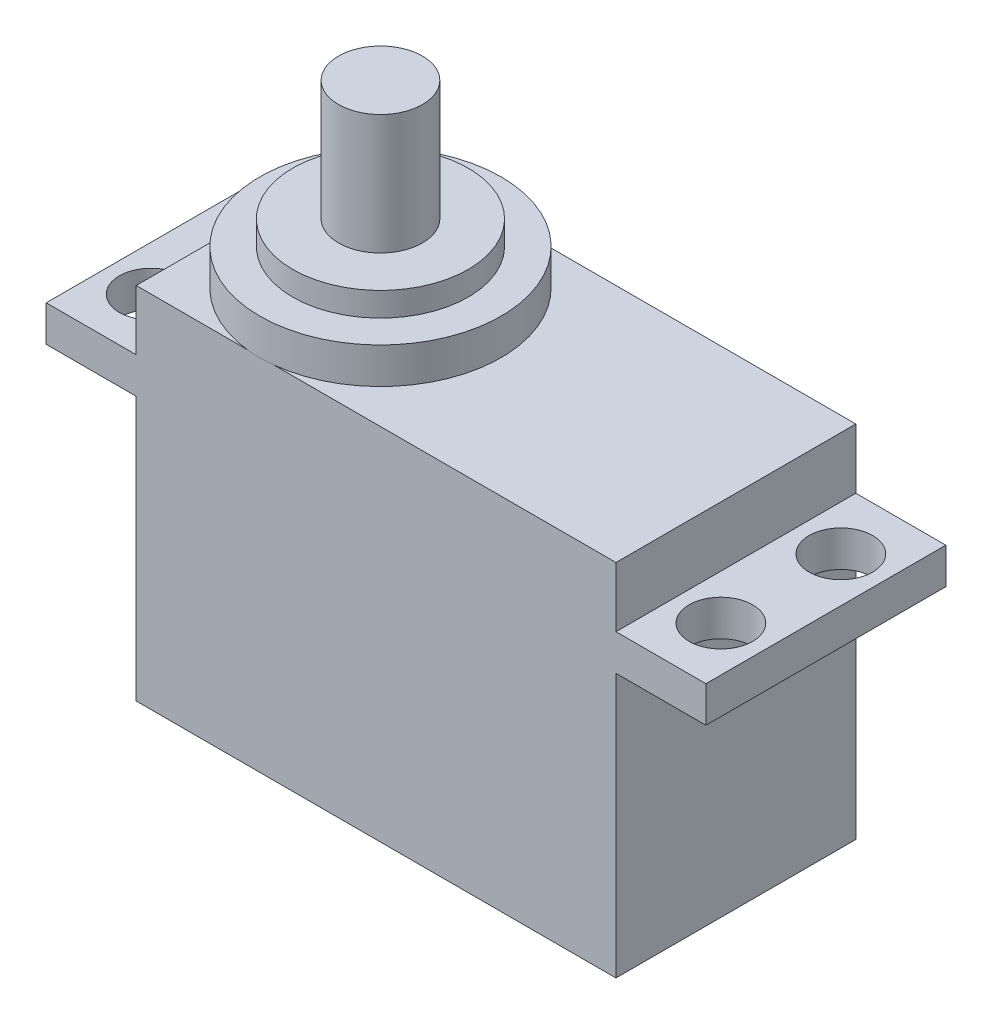
ISO-10303-21;
HEADER;
FILE_DESCRIPTION(('STEP AP214'),'2;1');
FILE_NAME('part.step','',(''),(''),'','','');
FILE_SCHEMA(('AUTOMOTIVE_DESIGN { 1 0 10303 214 1 1 1 1 }'));
ENDSEC;
DATA;
#1=APPLICATION_CONTEXT('core data for automotive mechanical design processes');
#2=APPLICATION_PROTOCOL_DEFINITION('international standard','automotive_design',2000,#1);
#3=PRODUCT_CONTEXT('',#1,'mechanical');
#4=PRODUCT('Part','Part','',(#3));
#5=PRODUCT_RELATED_PRODUCT_CATEGORY('part','',(#4));
#6=PRODUCT_DEFINITION_FORMATION('','',#4);
#7=PRODUCT_DEFINITION_CONTEXT('part definition',#1,'design');
#8=PRODUCT_DEFINITION('design','',#6,#7);
#9=PRODUCT_DEFINITION_SHAPE('','',#8);
#10=(LENGTH_UNIT() NAMED_UNIT(*) SI_UNIT(.MILLI.,.METRE.));
#11=(NAMED_UNIT(*) PLANE_ANGLE_UNIT() SI_UNIT($,.RADIAN.));
#12=(NAMED_UNIT(*) SI_UNIT($,.STERADIAN.) SOLID_ANGLE_UNIT());
#13=UNCERTAINTY_MEASURE_WITH_UNIT(LENGTH_MEASURE(1.E-05),#10,'distance_accuracy_value','');
#14=(GEOMETRIC_REPRESENTATION_CONTEXT(3) GLOBAL_UNCERTAINTY_ASSIGNED_CONTEXT((#13)) GLOBAL_UNIT_ASSIGNED_CONTEXT((#10,
#11,#12)) REPRESENTATION_CONTEXT('',''));
#15=CARTESIAN_POINT('',(0.,0.,0.));
#16=DIRECTION('',(0.,0.,1.));
#17=DIRECTION('',(1.,0.,0.));
#18=AXIS2_PLACEMENT_3D('',#15,#16,#17);
#19=CARTESIAN_POINT('',(0.,30.,0.));
#20=DIRECTION('',(0.,-1.,0.));
#21=DIRECTION('',(0.,0.,-1.));
#22=AXIS2_PLACEMENT_3D('',#19,#20,#21);
#23=PLANE('',#22);
#24=CARTESIAN_POINT('',(-9.63155127611361,30.,0.));
#25=DIRECTION('',(0.,1.,0.));
#26=DIRECTION('',(0.,0.,1.));
#27=AXIS2_PLACEMENT_3D('',#24,#25,#26);
#28=CIRCLE('',#27,10.0603687613684);
#29=CARTESIAN_POINT('',(-8.53108791247185,30.,10.));
#30=VERTEX_POINT('',#29);
#31=CARTESIAN_POINT('',(-8.53108791247189,30.,-10.));
#32=VERTEX_POINT('',#31);
#33=EDGE_CURVE('E43',#30,#32,#28,.T.);
#34=ORIENTED_EDGE('',*,*,#33,.F.);
#35=DIRECTION('',(1.,0.,0.));
#36=VECTOR('',#35,1.);
#37=CARTESIAN_POINT('',(-20.,30.,10.));
#38=LINE('',#37,#36);
#39=CARTESIAN_POINT('',(20.,30.,10.));
#40=VERTEX_POINT('',#39);
#41=EDGE_CURVE('E144',#30,#40,#38,.T.);
#42=ORIENTED_EDGE('',*,*,#41,.T.);
#43=DIRECTION('',(0.,0.,-1.));
#44=VECTOR('',#43,1.);
#45=CARTESIAN_POINT('',(20.,30.,10.));
#46=LINE('',#45,#44);
#47=CARTESIAN_POINT('',(20.,30.,-10.));
#48=VERTEX_POINT('',#47);
#49=EDGE_CURVE('E227',#40,#48,#46,.T.);
#50=ORIENTED_EDGE('',*,*,#49,.T.);
#51=DIRECTION('',(-1.,0.,0.));
#52=VECTOR('',#51,1.);
#53=CARTESIAN_POINT('',(-20.,30.,-10.));
#54=LINE('',#53,#52);
#55=EDGE_CURVE('E232',#48,#32,#54,.T.);
#56=ORIENTED_EDGE('',*,*,#55,.T.);
#57=EDGE_LOOP('',(#34,#42,#50,#56));
#58=FACE_BOUND('',#57,.T.);
#59=ADVANCED_FACE('F32',(#58),#23,.F.);
#60=CARTESIAN_POINT('',(20.,30.,10.));
#61=DIRECTION('',(-1.,0.,0.));
#62=DIRECTION('',(0.,0.,1.));
#63=AXIS2_PLACEMENT_3D('',#60,#61,#62);
#64=PLANE('',#63);
#65=DIRECTION('',(0.,0.,1.));
#66=VECTOR('',#65,1.);
#67=CARTESIAN_POINT('',(20.,25.,10.));
#68=LINE('',#67,#66);
#69=CARTESIAN_POINT('',(20.,25.,-10.));
#70=VERTEX_POINT('',#69);
#71=CARTESIAN_POINT('',(20.,25.,10.));
#72=VERTEX_POINT('',#71);
#73=EDGE_CURVE('E224',#70,#72,#68,.T.);
#74=ORIENTED_EDGE('',*,*,#73,.F.);
#75=DIRECTION('',(0.,-1.,0.));
#76=VECTOR('',#75,1.);
#77=CARTESIAN_POINT('',(20.,30.,-10.));
#78=LINE('',#77,#76);
#79=EDGE_CURVE('E41',#48,#70,#78,.T.);
#80=ORIENTED_EDGE('',*,*,#79,.F.);
#81=ORIENTED_EDGE('',*,*,#49,.F.);
#82=DIRECTION('',(0.,-1.,0.));
#83=VECTOR('',#82,1.);
#84=CARTESIAN_POINT('',(20.,30.,10.));
#85=LINE('',#84,#83);
#86=EDGE_CURVE('E246',#40,#72,#85,.T.);
#87=ORIENTED_EDGE('',*,*,#86,.T.);
#88=EDGE_LOOP('',(#74,#80,#81,#87));
#89=FACE_BOUND('',#88,.T.);
#90=ADVANCED_FACE('F323',(#89),#64,.F.);
#91=CARTESIAN_POINT('',(-20.,30.,10.));
#92=DIRECTION('',(1.,0.,0.));
#93=DIRECTION('',(0.,0.,-1.));
#94=AXIS2_PLACEMENT_3D('',#91,#92,#93);
#95=PLANE('',#94);
#96=DIRECTION('',(0.,0.,-1.));
#97=VECTOR('',#96,1.);
#98=CARTESIAN_POINT('',(-20.,25.,10.));
#99=LINE('',#98,#97);
#100=CARTESIAN_POINT('',(-20.,25.,10.));
#101=VERTEX_POINT('',#100);
#102=CARTESIAN_POINT('',(-20.,25.,-10.));
#103=VERTEX_POINT('',#102);
#104=EDGE_CURVE('E222',#101,#103,#99,.T.);
#105=ORIENTED_EDGE('',*,*,#104,.F.);
#106=DIRECTION('',(0.,-1.,0.));
#107=VECTOR('',#106,1.);
#108=CARTESIAN_POINT('',(-20.,30.,10.));
#109=LINE('',#108,#107);
#110=CARTESIAN_POINT('',(-20.,30.,10.));
#111=VERTEX_POINT('',#110);
#112=EDGE_CURVE('E250',#111,#101,#109,.T.);
#113=ORIENTED_EDGE('',*,*,#112,.F.);
#114=DIRECTION('',(0.,0.,1.));
#115=VECTOR('',#114,1.);
#116=CARTESIAN_POINT('',(-20.,30.,10.));
#117=LINE('',#116,#115);
#118=CARTESIAN_POINT('',(-20.,30.,-10.));
#119=VERTEX_POINT('',#118);
#120=EDGE_CURVE('E137',#119,#111,#117,.T.);
#121=ORIENTED_EDGE('',*,*,#120,.F.);
#122=DIRECTION('',(0.,-1.,0.));
#123=VECTOR('',#122,1.);
#124=CARTESIAN_POINT('',(-20.,30.,-10.));
#125=LINE('',#124,#123);
#126=EDGE_CURVE('E253',#119,#103,#125,.T.);
#127=ORIENTED_EDGE('',*,*,#126,.T.);
#128=EDGE_LOOP('',(#105,#113,#121,#127));
#129=FACE_BOUND('',#128,.T.);
#130=ADVANCED_FACE('F306',(#129),#95,.F.);
#131=CARTESIAN_POINT('',(20.,22.,-10.));
#132=VERTEX_POINT('',#131);
#133=CARTESIAN_POINT('',(20.,0.,-10.));
#134=VERTEX_POINT('',#133);
#135=EDGE_CURVE('E256',#132,#134,#78,.T.);
#136=ORIENTED_EDGE('',*,*,#135,.F.);
#137=DIRECTION('',(0.,0.,1.));
#138=VECTOR('',#137,1.);
#139=CARTESIAN_POINT('',(20.,22.,10.));
#140=LINE('',#139,#138);
#141=CARTESIAN_POINT('',(20.,22.,10.));
#142=VERTEX_POINT('',#141);
#143=EDGE_CURVE('E219',#132,#142,#140,.T.);
#144=ORIENTED_EDGE('',*,*,#143,.T.);
#145=CARTESIAN_POINT('',(20.,0.,10.));
#146=VERTEX_POINT('',#145);
#147=EDGE_CURVE('E141',#142,#146,#85,.T.);
#148=ORIENTED_EDGE('',*,*,#147,.T.);
#149=DIRECTION('',(0.,0.,-1.));
#150=VECTOR('',#149,1.);
#151=CARTESIAN_POINT('',(20.,0.,10.));
#152=LINE('',#151,#150);
#153=EDGE_CURVE('E226',#146,#134,#152,.T.);
#154=ORIENTED_EDGE('',*,*,#153,.T.);
#155=EDGE_LOOP('',(#136,#144,#148,#154));
#156=FACE_BOUND('',#155,.T.);
#157=ADVANCED_FACE('F34',(#156),#64,.F.);
#158=CARTESIAN_POINT('',(-20.,30.,-10.));
#159=DIRECTION('',(0.,0.,1.));
#160=DIRECTION('',(1.,0.,0.));
#161=AXIS2_PLACEMENT_3D('',#158,#159,#160);
#162=PLANE('',#161);
#163=CARTESIAN_POINT('',(-20.,22.,-10.));
#164=VERTEX_POINT('',#163);
#165=CARTESIAN_POINT('',(-20.,0.,-10.));
#166=VERTEX_POINT('',#165);
#167=EDGE_CURVE('E252',#164,#166,#125,.T.);
#168=ORIENTED_EDGE('',*,*,#167,.F.);
#169=DIRECTION('',(-1.,0.,0.));
#170=VECTOR('',#169,1.);
#171=CARTESIAN_POINT('',(-27.5,22.,-10.));
#172=LINE('',#171,#170);
#173=CARTESIAN_POINT('',(-27.5,22.,-10.));
#174=VERTEX_POINT('',#173);
#175=EDGE_CURVE('E196',#164,#174,#172,.T.);
#176=ORIENTED_EDGE('',*,*,#175,.T.);
#177=DIRECTION('',(0.,-1.,0.));
#178=VECTOR('',#177,1.);
#179=CARTESIAN_POINT('',(-27.5,25.,-10.));
#180=LINE('',#179,#178);
#181=CARTESIAN_POINT('',(-27.5,25.,-10.));
#182=VERTEX_POINT('',#181);
#183=EDGE_CURVE('E210',#182,#174,#180,.T.);
#184=ORIENTED_EDGE('',*,*,#183,.F.);
#185=DIRECTION('',(-1.,0.,0.));
#186=VECTOR('',#185,1.);
#187=CARTESIAN_POINT('',(-27.5,25.,-10.));
#188=LINE('',#187,#186);
#189=EDGE_CURVE('E183',#103,#182,#188,.T.);
#190=ORIENTED_EDGE('',*,*,#189,.F.);
#191=ORIENTED_EDGE('',*,*,#126,.F.);
#192=CARTESIAN_POINT('',(-10.7320146397553,30.,-10.));
#193=VERTEX_POINT('',#192);
#194=EDGE_CURVE('E230',#193,#119,#54,.T.);
#195=ORIENTED_EDGE('',*,*,#194,.F.);
#196=EDGE_CURVE('E234',#32,#193,#54,.T.);
#197=ORIENTED_EDGE('',*,*,#196,.F.);
#198=ORIENTED_EDGE('',*,*,#55,.F.);
#199=ORIENTED_EDGE('',*,*,#79,.T.);
#200=CARTESIAN_POINT('',(27.5,25.,-10.));
#201=VERTEX_POINT('',#200);
#202=EDGE_CURVE('E185',#201,#70,#188,.T.);
#203=ORIENTED_EDGE('',*,*,#202,.F.);
#204=DIRECTION('',(0.,-1.,0.));
#205=VECTOR('',#204,1.);
#206=CARTESIAN_POINT('',(27.5,25.,-10.));
#207=LINE('',#206,#205);
#208=CARTESIAN_POINT('',(27.5,22.,-10.));
#209=VERTEX_POINT('',#208);
#210=EDGE_CURVE('E213',#201,#209,#207,.T.);
#211=ORIENTED_EDGE('',*,*,#210,.T.);
#212=EDGE_CURVE('E197',#209,#132,#172,.T.);
#213=ORIENTED_EDGE('',*,*,#212,.T.);
#214=ORIENTED_EDGE('',*,*,#135,.T.);
#215=DIRECTION('',(-1.,0.,0.));
#216=VECTOR('',#215,1.);
#217=CARTESIAN_POINT('',(-20.,0.,-10.));
#218=LINE('',#217,#216);
#219=EDGE_CURVE('E238',#134,#166,#218,.T.);
#220=ORIENTED_EDGE('',*,*,#219,.T.);
#221=EDGE_LOOP('',(#168,#176,#184,#190,#191,#195,#197,#198,#199,#203,#211,#213,#214,#220));
#222=FACE_BOUND('',#221,.T.);
#223=ADVANCED_FACE('F281',(#222),#162,.F.);
#224=CARTESIAN_POINT('',(-20.,22.,10.));
#225=VERTEX_POINT('',#224);
#226=CARTESIAN_POINT('',(-20.,0.,10.));
#227=VERTEX_POINT('',#226);
#228=EDGE_CURVE('E249',#225,#227,#109,.T.);
#229=ORIENTED_EDGE('',*,*,#228,.F.);
#230=DIRECTION('',(0.,0.,-1.));
#231=VECTOR('',#230,1.);
#232=CARTESIAN_POINT('',(-20.,22.,10.));
#233=LINE('',#232,#231);
#234=EDGE_CURVE('E216',#225,#164,#233,.T.);
#235=ORIENTED_EDGE('',*,*,#234,.T.);
#236=ORIENTED_EDGE('',*,*,#167,.T.);
#237=DIRECTION('',(0.,0.,1.));
#238=VECTOR('',#237,1.);
#239=CARTESIAN_POINT('',(-20.,0.,10.));
#240=LINE('',#239,#238);
#241=EDGE_CURVE('E241',#166,#227,#240,.T.);
#242=ORIENTED_EDGE('',*,*,#241,.T.);
#243=EDGE_LOOP('',(#229,#235,#236,#242));
#244=FACE_BOUND('',#243,.T.);
#245=ADVANCED_FACE('F292',(#244),#95,.F.);
#246=CARTESIAN_POINT('',(-20.,30.,10.));
#247=DIRECTION('',(0.,0.,-1.));
#248=DIRECTION('',(-1.,0.,0.));
#249=AXIS2_PLACEMENT_3D('',#246,#247,#248);
#250=PLANE('',#249);
#251=ORIENTED_EDGE('',*,*,#147,.F.);
#252=DIRECTION('',(1.,0.,0.));
#253=VECTOR('',#252,1.);
#254=CARTESIAN_POINT('',(-27.5,22.,10.));
#255=LINE('',#254,#253);
#256=CARTESIAN_POINT('',(27.5,22.,10.));
#257=VERTEX_POINT('',#256);
#258=EDGE_CURVE('E202',#142,#257,#255,.T.);
#259=ORIENTED_EDGE('',*,*,#258,.T.);
#260=DIRECTION('',(0.,-1.,0.));
#261=VECTOR('',#260,1.);
#262=CARTESIAN_POINT('',(27.5,25.,10.));
#263=LINE('',#262,#261);
#264=CARTESIAN_POINT('',(27.5,25.,10.));
#265=VERTEX_POINT('',#264);
#266=EDGE_CURVE('E192',#265,#257,#263,.T.);
#267=ORIENTED_EDGE('',*,*,#266,.F.);
#268=DIRECTION('',(1.,0.,0.));
#269=VECTOR('',#268,1.);
#270=CARTESIAN_POINT('',(-27.5,25.,10.));
#271=LINE('',#270,#269);
#272=EDGE_CURVE('E189',#72,#265,#271,.T.);
#273=ORIENTED_EDGE('',*,*,#272,.F.);
#274=ORIENTED_EDGE('',*,*,#86,.F.);
#275=ORIENTED_EDGE('',*,*,#41,.F.);
#276=CARTESIAN_POINT('',(-10.7320146397554,30.,10.));
#277=VERTEX_POINT('',#276);
#278=EDGE_CURVE('E142',#277,#30,#38,.T.);
#279=ORIENTED_EDGE('',*,*,#278,.F.);
#280=EDGE_CURVE('E133',#111,#277,#38,.T.);
#281=ORIENTED_EDGE('',*,*,#280,.F.);
#282=ORIENTED_EDGE('',*,*,#112,.T.);
#283=CARTESIAN_POINT('',(-27.5,25.,10.));
#284=VERTEX_POINT('',#283);
#285=EDGE_CURVE('E190',#284,#101,#271,.T.);
#286=ORIENTED_EDGE('',*,*,#285,.F.);
#287=DIRECTION('',(0.,-1.,0.));
#288=VECTOR('',#287,1.);
#289=CARTESIAN_POINT('',(-27.5,25.,10.));
#290=LINE('',#289,#288);
#291=CARTESIAN_POINT('',(-27.5,22.,10.));
#292=VERTEX_POINT('',#291);
#293=EDGE_CURVE('E207',#284,#292,#290,.T.);
#294=ORIENTED_EDGE('',*,*,#293,.T.);
#295=EDGE_CURVE('E184',#292,#225,#255,.T.);
#296=ORIENTED_EDGE('',*,*,#295,.T.);
#297=ORIENTED_EDGE('',*,*,#228,.T.);
#298=DIRECTION('',(1.,0.,0.));
#299=VECTOR('',#298,1.);
#300=CARTESIAN_POINT('',(-20.,0.,10.));
#301=LINE('',#300,#299);
#302=EDGE_CURVE('E231',#227,#146,#301,.T.);
#303=ORIENTED_EDGE('',*,*,#302,.T.);
#304=EDGE_LOOP('',(#251,#259,#267,#273,#274,#275,#279,#281,#282,#286,#294,#296,#297,#303));
#305=FACE_BOUND('',#304,.T.);
#306=ADVANCED_FACE('F148',(#305),#250,.F.);
#307=EDGE_CURVE('E11',#193,#277,#28,.T.);
#308=ORIENTED_EDGE('',*,*,#307,.F.);
#309=ORIENTED_EDGE('',*,*,#194,.T.);
#310=ORIENTED_EDGE('',*,*,#120,.T.);
#311=ORIENTED_EDGE('',*,*,#280,.T.);
#312=EDGE_LOOP('',(#308,#309,#310,#311));
#313=FACE_BOUND('',#312,.T.);
#314=ADVANCED_FACE('F135',(#313),#23,.F.);
#315=CARTESIAN_POINT('',(0.,0.,0.));
#316=DIRECTION('',(0.,-1.,0.));
#317=DIRECTION('',(0.,0.,-1.));
#318=AXIS2_PLACEMENT_3D('',#315,#316,#317);
#319=PLANE('',#318);
#320=ORIENTED_EDGE('',*,*,#153,.F.);
#321=ORIENTED_EDGE('',*,*,#302,.F.);
#322=ORIENTED_EDGE('',*,*,#241,.F.);
#323=ORIENTED_EDGE('',*,*,#219,.F.);
#324=EDGE_LOOP('',(#320,#321,#322,#323));
#325=FACE_BOUND('',#324,.T.);
#326=ADVANCED_FACE('F287',(#325),#319,.T.);
#327=CARTESIAN_POINT('',(-27.5,25.,10.));
#328=DIRECTION('',(1.,0.,0.));
#329=DIRECTION('',(0.,0.,-1.));
#330=AXIS2_PLACEMENT_3D('',#327,#328,#329);
#331=PLANE('',#330);
#332=DIRECTION('',(0.,0.,1.));
#333=VECTOR('',#332,1.);
#334=CARTESIAN_POINT('',(-27.5,22.,10.));
#335=LINE('',#334,#333);
#336=EDGE_CURVE('E200',#174,#292,#335,.T.);
#337=ORIENTED_EDGE('',*,*,#336,.T.);
#338=ORIENTED_EDGE('',*,*,#293,.F.);
#339=DIRECTION('',(0.,0.,1.));
#340=VECTOR('',#339,1.);
#341=CARTESIAN_POINT('',(-27.5,25.,10.));
#342=LINE('',#341,#340);
#343=EDGE_CURVE('E187',#182,#284,#342,.T.);
#344=ORIENTED_EDGE('',*,*,#343,.F.);
#345=ORIENTED_EDGE('',*,*,#183,.T.);
#346=EDGE_LOOP('',(#337,#338,#344,#345));
#347=FACE_BOUND('',#346,.T.);
#348=ADVANCED_FACE('F300',(#347),#331,.F.);
#349=CARTESIAN_POINT('',(0.,25.,0.));
#350=DIRECTION('',(0.,-1.,0.));
#351=DIRECTION('',(0.,0.,-1.));
#352=AXIS2_PLACEMENT_3D('',#349,#350,#351);
#353=PLANE('',#352);
#354=CARTESIAN_POINT('',(-23.75,25.,5.00174062962656));
#355=DIRECTION('',(0.,1.,0.));
#356=DIRECTION('',(0.,0.,-1.));
#357=AXIS2_PLACEMENT_3D('',#354,#355,#356);
#358=CIRCLE('',#357,2.64700829182336);
#359=CARTESIAN_POINT('',(-23.75,25.,2.3547323378032));
#360=VERTEX_POINT('',#359);
#361=EDGE_CURVE('E172',#360,#360,#358,.T.);
#362=ORIENTED_EDGE('',*,*,#361,.F.);
#363=EDGE_LOOP('',(#362));
#364=FACE_BOUND('',#363,.T.);
#365=CARTESIAN_POINT('',(-23.75,25.,-5.00174062962656));
#366=DIRECTION('',(0.,1.,0.));
#367=DIRECTION('',(0.,0.,1.));
#368=AXIS2_PLACEMENT_3D('',#365,#366,#367);
#369=CIRCLE('',#368,2.64700829182336);
#370=CARTESIAN_POINT('',(-23.75,25.,-2.3547323378032));
#371=VERTEX_POINT('',#370);
#372=EDGE_CURVE('E176',#371,#371,#369,.T.);
#373=ORIENTED_EDGE('',*,*,#372,.F.);
#374=EDGE_LOOP('',(#373));
#375=FACE_BOUND('',#374,.T.);
#376=ORIENTED_EDGE('',*,*,#285,.T.);
#377=ORIENTED_EDGE('',*,*,#104,.T.);
#378=ORIENTED_EDGE('',*,*,#189,.T.);
#379=ORIENTED_EDGE('',*,*,#343,.T.);
#380=EDGE_LOOP('',(#376,#377,#378,#379));
#381=FACE_BOUND('',#380,.T.);
#382=ADVANCED_FACE('F307',(#364,#375,#381),#353,.F.);
#383=CARTESIAN_POINT('',(0.,22.,0.));
#384=DIRECTION('',(0.,-1.,0.));
#385=DIRECTION('',(0.,0.,-1.));
#386=AXIS2_PLACEMENT_3D('',#383,#384,#385);
#387=PLANE('',#386);
#388=CARTESIAN_POINT('',(-23.75,22.,5.00174062962656));
#389=DIRECTION('',(0.,-1.,0.));
#390=DIRECTION('',(0.,0.,-1.));
#391=AXIS2_PLACEMENT_3D('',#388,#389,#390);
#392=CIRCLE('',#391,2.64700829182336);
#393=CARTESIAN_POINT('',(-23.75,22.,2.3547323378032));
#394=VERTEX_POINT('',#393);
#395=EDGE_CURVE('E175',#394,#394,#392,.T.);
#396=ORIENTED_EDGE('',*,*,#395,.F.);
#397=EDGE_LOOP('',(#396));
#398=FACE_BOUND('',#397,.T.);
#399=CARTESIAN_POINT('',(-23.75,22.,-5.00174062962656));
#400=DIRECTION('',(0.,-1.,0.));
#401=DIRECTION('',(0.,0.,-1.));
#402=AXIS2_PLACEMENT_3D('',#399,#400,#401);
#403=CIRCLE('',#402,2.64700829182336);
#404=CARTESIAN_POINT('',(-23.75,22.,-7.64874892144991));
#405=VERTEX_POINT('',#404);
#406=EDGE_CURVE('E179',#405,#405,#403,.T.);
#407=ORIENTED_EDGE('',*,*,#406,.F.);
#408=EDGE_LOOP('',(#407));
#409=FACE_BOUND('',#408,.T.);
#410=ORIENTED_EDGE('',*,*,#234,.F.);
#411=ORIENTED_EDGE('',*,*,#295,.F.);
#412=ORIENTED_EDGE('',*,*,#336,.F.);
#413=ORIENTED_EDGE('',*,*,#175,.F.);
#414=EDGE_LOOP('',(#410,#411,#412,#413));
#415=FACE_BOUND('',#414,.T.);
#416=ADVANCED_FACE('F275',(#398,#409,#415),#387,.T.);
#417=CARTESIAN_POINT('',(23.75,25.,-5.00174062962656));
#418=DIRECTION('',(0.,1.,0.));
#419=DIRECTION('',(0.,0.,-1.));
#420=AXIS2_PLACEMENT_3D('',#417,#418,#419);
#421=CIRCLE('',#420,2.64700829182336);
#422=CARTESIAN_POINT('',(23.75,25.,-7.64874892144992));
#423=VERTEX_POINT('',#422);
#424=EDGE_CURVE('E165',#423,#423,#421,.T.);
#425=ORIENTED_EDGE('',*,*,#424,.F.);
#426=EDGE_LOOP('',(#425));
#427=FACE_BOUND('',#426,.T.);
#428=CARTESIAN_POINT('',(23.75,25.,5.00174062962654));
#429=DIRECTION('',(0.,1.,0.));
#430=DIRECTION('',(0.,0.,1.));
#431=AXIS2_PLACEMENT_3D('',#428,#429,#430);
#432=CIRCLE('',#431,2.64700829182336);
#433=CARTESIAN_POINT('',(23.75,25.,7.6487489214499));
#434=VERTEX_POINT('',#433);
#435=EDGE_CURVE('E168',#434,#434,#432,.T.);
#436=ORIENTED_EDGE('',*,*,#435,.F.);
#437=EDGE_LOOP('',(#436));
#438=FACE_BOUND('',#437,.T.);
#439=ORIENTED_EDGE('',*,*,#202,.T.);
#440=ORIENTED_EDGE('',*,*,#73,.T.);
#441=ORIENTED_EDGE('',*,*,#272,.T.);
#442=DIRECTION('',(0.,0.,-1.));
#443=VECTOR('',#442,1.);
#444=CARTESIAN_POINT('',(27.5,25.,10.));
#445=LINE('',#444,#443);
#446=EDGE_CURVE('E180',#265,#201,#445,.T.);
#447=ORIENTED_EDGE('',*,*,#446,.T.);
#448=EDGE_LOOP('',(#439,#440,#441,#447));
#449=FACE_BOUND('',#448,.T.);
#450=ADVANCED_FACE('F272',(#427,#438,#449),#353,.F.);
#451=CARTESIAN_POINT('',(23.75,22.,-5.00174062962656));
#452=DIRECTION('',(0.,-1.,0.));
#453=DIRECTION('',(0.,0.,-1.));
#454=AXIS2_PLACEMENT_3D('',#451,#452,#453);
#455=CIRCLE('',#454,2.64700829182336);
#456=CARTESIAN_POINT('',(23.75,22.,-7.64874892144992));
#457=VERTEX_POINT('',#456);
#458=EDGE_CURVE('E36',#457,#457,#455,.T.);
#459=ORIENTED_EDGE('',*,*,#458,.F.);
#460=EDGE_LOOP('',(#459));
#461=FACE_BOUND('',#460,.T.);
#462=CARTESIAN_POINT('',(23.75,22.,5.00174062962654));
#463=DIRECTION('',(0.,-1.,0.));
#464=DIRECTION('',(0.,0.,-1.));
#465=AXIS2_PLACEMENT_3D('',#462,#463,#464);
#466=CIRCLE('',#465,2.64700829182336);
#467=CARTESIAN_POINT('',(23.75,22.,2.35473233780319));
#468=VERTEX_POINT('',#467);
#469=EDGE_CURVE('E171',#468,#468,#466,.T.);
#470=ORIENTED_EDGE('',*,*,#469,.F.);
#471=EDGE_LOOP('',(#470));
#472=FACE_BOUND('',#471,.T.);
#473=ORIENTED_EDGE('',*,*,#143,.F.);
#474=ORIENTED_EDGE('',*,*,#212,.F.);
#475=DIRECTION('',(0.,0.,-1.));
#476=VECTOR('',#475,1.);
#477=CARTESIAN_POINT('',(27.5,22.,10.));
#478=LINE('',#477,#476);
#479=EDGE_CURVE('E193',#257,#209,#478,.T.);
#480=ORIENTED_EDGE('',*,*,#479,.F.);
#481=ORIENTED_EDGE('',*,*,#258,.F.);
#482=EDGE_LOOP('',(#473,#474,#480,#481));
#483=FACE_BOUND('',#482,.T.);
#484=ADVANCED_FACE('F268',(#461,#472,#483),#387,.T.);
#485=CARTESIAN_POINT('',(27.5,25.,10.));
#486=DIRECTION('',(-1.,0.,0.));
#487=DIRECTION('',(0.,0.,1.));
#488=AXIS2_PLACEMENT_3D('',#485,#486,#487);
#489=PLANE('',#488);
#490=ORIENTED_EDGE('',*,*,#479,.T.);
#491=ORIENTED_EDGE('',*,*,#210,.F.);
#492=ORIENTED_EDGE('',*,*,#446,.F.);
#493=ORIENTED_EDGE('',*,*,#266,.T.);
#494=EDGE_LOOP('',(#490,#491,#492,#493));
#495=FACE_BOUND('',#494,.T.);
#496=ADVANCED_FACE('F271',(#495),#489,.F.);
#497=CARTESIAN_POINT('',(-23.75,12.,-5.00174062962656));
#498=DIRECTION('',(0.,1.,0.));
#499=DIRECTION('',(0.,0.,1.));
#500=AXIS2_PLACEMENT_3D('',#497,#498,#499);
#501=CYLINDRICAL_SURFACE('',#500,2.64700829182336);
#502=ORIENTED_EDGE('',*,*,#406,.T.);
#503=EDGE_LOOP('',(#502));
#504=FACE_BOUND('',#503,.T.);
#505=ORIENTED_EDGE('',*,*,#372,.T.);
#506=EDGE_LOOP('',(#505));
#507=FACE_BOUND('',#506,.T.);
#508=ADVANCED_FACE('F381',(#504,#507),#501,.F.);
#509=CARTESIAN_POINT('',(-23.75,12.,5.00174062962656));
#510=DIRECTION('',(0.,1.,0.));
#511=DIRECTION('',(0.,0.,1.));
#512=AXIS2_PLACEMENT_3D('',#509,#510,#511);
#513=CYLINDRICAL_SURFACE('',#512,2.64700829182336);
#514=ORIENTED_EDGE('',*,*,#395,.T.);
#515=EDGE_LOOP('',(#514));
#516=FACE_BOUND('',#515,.T.);
#517=ORIENTED_EDGE('',*,*,#361,.T.);
#518=EDGE_LOOP('',(#517));
#519=FACE_BOUND('',#518,.T.);
#520=ADVANCED_FACE('F412',(#516,#519),#513,.F.);
#521=CARTESIAN_POINT('',(23.75,12.,5.00174062962654));
#522=DIRECTION('',(0.,1.,0.));
#523=DIRECTION('',(0.,0.,1.));
#524=AXIS2_PLACEMENT_3D('',#521,#522,#523);
#525=CYLINDRICAL_SURFACE('',#524,2.64700829182336);
#526=ORIENTED_EDGE('',*,*,#469,.T.);
#527=EDGE_LOOP('',(#526));
#528=FACE_BOUND('',#527,.T.);
#529=ORIENTED_EDGE('',*,*,#435,.T.);
#530=EDGE_LOOP('',(#529));
#531=FACE_BOUND('',#530,.T.);
#532=ADVANCED_FACE('F265',(#528,#531),#525,.F.);
#533=CARTESIAN_POINT('',(23.75,12.,-5.00174062962656));
#534=DIRECTION('',(0.,1.,0.));
#535=DIRECTION('',(0.,0.,1.));
#536=AXIS2_PLACEMENT_3D('',#533,#534,#535);
#537=CYLINDRICAL_SURFACE('',#536,2.64700829182336);
#538=ORIENTED_EDGE('',*,*,#458,.T.);
#539=EDGE_LOOP('',(#538));
#540=FACE_BOUND('',#539,.T.);
#541=ORIENTED_EDGE('',*,*,#424,.T.);
#542=EDGE_LOOP('',(#541));
#543=FACE_BOUND('',#542,.T.);
#544=ADVANCED_FACE('F430',(#540,#543),#537,.F.);
#545=CARTESIAN_POINT('',(-9.63155127611361,30.,0.));
#546=DIRECTION('',(0.,1.,0.));
#547=DIRECTION('',(0.,0.,1.));
#548=AXIS2_PLACEMENT_3D('',#545,#546,#547);
#549=PLANE('',#548);
#550=EDGE_CURVE('E44',#32,#193,#28,.T.);
#551=ORIENTED_EDGE('',*,*,#550,.F.);
#552=ORIENTED_EDGE('',*,*,#196,.T.);
#553=EDGE_LOOP('',(#551,#552));
#554=FACE_BOUND('',#553,.T.);
#555=ADVANCED_FACE('F438',(#554),#549,.F.);
#556=EDGE_CURVE('E152',#277,#30,#28,.T.);
#557=ORIENTED_EDGE('',*,*,#556,.F.);
#558=ORIENTED_EDGE('',*,*,#278,.T.);
#559=EDGE_LOOP('',(#557,#558));
#560=FACE_BOUND('',#559,.T.);
#561=ADVANCED_FACE('F153',(#560),#549,.F.);
#562=CARTESIAN_POINT('',(-9.63155127611361,33.,0.));
#563=DIRECTION('',(0.,-1.,0.));
#564=DIRECTION('',(0.,0.,-1.));
#565=AXIS2_PLACEMENT_3D('',#562,#563,#564);
#566=CYLINDRICAL_SURFACE('',#565,10.0603687613684);
#567=CARTESIAN_POINT('',(-9.63155127611361,33.,0.));
#568=DIRECTION('',(0.,1.,0.));
#569=DIRECTION('',(0.,0.,1.));
#570=AXIS2_PLACEMENT_3D('',#567,#568,#569);
#571=CIRCLE('',#570,10.0603687613684);
#572=CARTESIAN_POINT('',(-9.63155127611361,33.,10.0603687613684));
#573=VERTEX_POINT('',#572);
#574=EDGE_CURVE('E161',#573,#573,#571,.T.);
#575=ORIENTED_EDGE('',*,*,#574,.F.);
#576=EDGE_LOOP('',(#575));
#577=FACE_BOUND('',#576,.T.);
#578=ORIENTED_EDGE('',*,*,#33,.T.);
#579=ORIENTED_EDGE('',*,*,#550,.T.);
#580=ORIENTED_EDGE('',*,*,#307,.T.);
#581=ORIENTED_EDGE('',*,*,#556,.T.);
#582=EDGE_LOOP('',(#578,#579,#580,#581));
#583=FACE_BOUND('',#582,.T.);
#584=ADVANCED_FACE('F157',(#577,#583),#566,.T.);
#585=CARTESIAN_POINT('',(-9.63155127611361,33.,0.));
#586=DIRECTION('',(0.,1.,0.));
#587=DIRECTION('',(0.,0.,1.));
#588=AXIS2_PLACEMENT_3D('',#585,#586,#587);
#589=PLANE('',#588);
#590=CARTESIAN_POINT('',(-9.63155127611361,33.,0.));
#591=DIRECTION('',(0.,1.,0.));
#592=DIRECTION('',(0.,0.,1.));
#593=AXIS2_PLACEMENT_3D('',#590,#591,#592);
#594=CIRCLE('',#593,7.31765102127046);
#595=CARTESIAN_POINT('',(-9.63155127611361,33.,7.31765102127046));
#596=VERTEX_POINT('',#595);
#597=EDGE_CURVE('E536',#596,#596,#594,.T.);
#598=ORIENTED_EDGE('',*,*,#597,.F.);
#599=EDGE_LOOP('',(#598));
#600=FACE_BOUND('',#599,.T.);
#601=ORIENTED_EDGE('',*,*,#574,.T.);
#602=EDGE_LOOP('',(#601));
#603=FACE_BOUND('',#602,.T.);
#604=ADVANCED_FACE('F479',(#600,#603),#589,.T.);
#605=CARTESIAN_POINT('',(-9.63155127611361,35.,0.));
#606=DIRECTION('',(0.,-1.,0.));
#607=DIRECTION('',(0.,0.,-1.));
#608=AXIS2_PLACEMENT_3D('',#605,#606,#607);
#609=CYLINDRICAL_SURFACE('',#608,7.31765102127046);
#610=CARTESIAN_POINT('',(-9.63155127611361,35.,0.));
#611=DIRECTION('',(0.,1.,0.));
#612=DIRECTION('',(0.,0.,1.));
#613=AXIS2_PLACEMENT_3D('',#610,#611,#612);
#614=CIRCLE('',#613,7.31765102127046);
#615=CARTESIAN_POINT('',(-9.63155127611361,35.,7.31765102127046));
#616=VERTEX_POINT('',#615);
#617=EDGE_CURVE('E155',#616,#616,#614,.T.);
#618=ORIENTED_EDGE('',*,*,#617,.F.);
#619=EDGE_LOOP('',(#618));
#620=FACE_BOUND('',#619,.T.);
#621=ORIENTED_EDGE('',*,*,#597,.T.);
#622=EDGE_LOOP('',(#621));
#623=FACE_BOUND('',#622,.T.);
#624=ADVANCED_FACE('F489',(#620,#623),#609,.T.);
#625=CARTESIAN_POINT('',(-9.63155127611361,35.,0.));
#626=DIRECTION('',(0.,1.,0.));
#627=DIRECTION('',(0.,0.,1.));
#628=AXIS2_PLACEMENT_3D('',#625,#626,#627);
#629=PLANE('',#628);
#630=CARTESIAN_POINT('',(-9.63155127611361,35.,0.));
#631=DIRECTION('',(0.,1.,0.));
#632=DIRECTION('',(0.,0.,1.));
#633=AXIS2_PLACEMENT_3D('',#630,#631,#632);
#634=CIRCLE('',#633,3.5);
#635=CARTESIAN_POINT('',(-9.63155127611361,35.,3.5));
#636=VERTEX_POINT('',#635);
#637=EDGE_CURVE('E537',#636,#636,#634,.T.);
#638=ORIENTED_EDGE('',*,*,#637,.F.);
#639=EDGE_LOOP('',(#638));
#640=FACE_BOUND('',#639,.T.);
#641=ORIENTED_EDGE('',*,*,#617,.T.);
#642=EDGE_LOOP('',(#641));
#643=FACE_BOUND('',#642,.T.);
#644=ADVANCED_FACE('F499',(#640,#643),#629,.T.);
#645=CARTESIAN_POINT('',(-9.63155127611361,45.,0.));
#646=DIRECTION('',(0.,-1.,0.));
#647=DIRECTION('',(0.,0.,-1.));
#648=AXIS2_PLACEMENT_3D('',#645,#646,#647);
#649=CYLINDRICAL_SURFACE('',#648,3.5);
#650=CARTESIAN_POINT('',(-9.63155127611361,45.,0.));
#651=DIRECTION('',(0.,1.,0.));
#652=DIRECTION('',(0.,0.,1.));
#653=AXIS2_PLACEMENT_3D('',#650,#651,#652);
#654=CIRCLE('',#653,3.5);
#655=CARTESIAN_POINT('',(-9.63155127611361,45.,3.5));
#656=VERTEX_POINT('',#655);
#657=EDGE_CURVE('E535',#656,#656,#654,.T.);
#658=ORIENTED_EDGE('',*,*,#657,.F.);
#659=EDGE_LOOP('',(#658));
#660=FACE_BOUND('',#659,.T.);
#661=ORIENTED_EDGE('',*,*,#637,.T.);
#662=EDGE_LOOP('',(#661));
#663=FACE_BOUND('',#662,.T.);
#664=ADVANCED_FACE('F509',(#660,#663),#649,.T.);
#665=CARTESIAN_POINT('',(-9.63155127611361,45.,0.));
#666=DIRECTION('',(0.,1.,0.));
#667=DIRECTION('',(0.,0.,1.));
#668=AXIS2_PLACEMENT_3D('',#665,#666,#667);
#669=PLANE('',#668);
#670=ORIENTED_EDGE('',*,*,#657,.T.);
#671=EDGE_LOOP('',(#670));
#672=FACE_BOUND('',#671,.T.);
#673=ADVANCED_FACE('F519',(#672),#669,.T.);
#674=CLOSED_SHELL('',(#59,#90,#130,#157,#223,#245,#306,#314,#326,#348,#382,#416,#450,#484,#496,
#508,#520,#532,#544,#555,#561,#584,#604,#624,#644,#664,#673));
#675=MANIFOLD_SOLID_BREP('B2',#674);
#676=ADVANCED_BREP_SHAPE_REPRESENTATION('',(#18,#675),#14);
#677=SHAPE_DEFINITION_REPRESENTATION(#9,#676);
ENDSEC;
END-ISO-10303-21;
